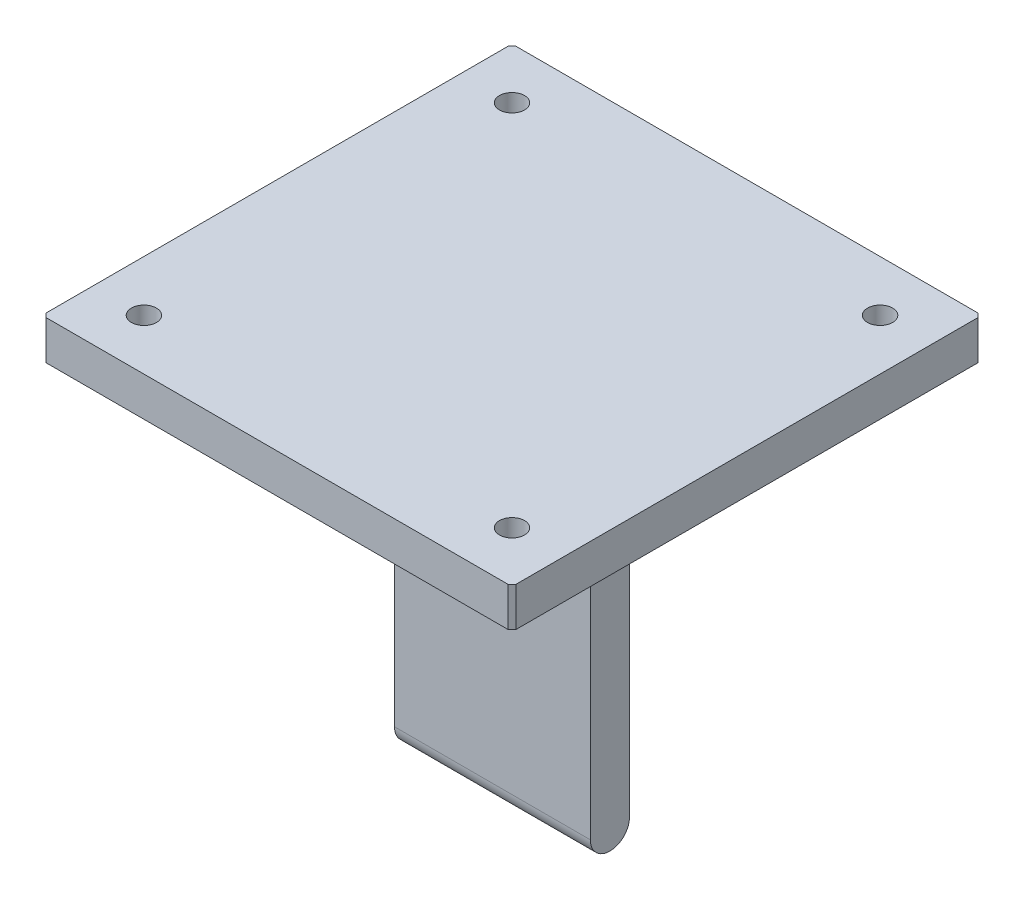
ISO-10303-21;
HEADER;
FILE_DESCRIPTION(('STEP AP214'),'2;1');
FILE_NAME('part.step','',(''),(''),'','','');
FILE_SCHEMA(('AUTOMOTIVE_DESIGN { 1 0 10303 214 1 1 1 1 }'));
ENDSEC;
DATA;
#1=APPLICATION_CONTEXT('core data for automotive mechanical design processes');
#2=APPLICATION_PROTOCOL_DEFINITION('international standard','automotive_design',2000,#1);
#3=PRODUCT_CONTEXT('',#1,'mechanical');
#4=PRODUCT('Part','Part','',(#3));
#5=PRODUCT_RELATED_PRODUCT_CATEGORY('part','',(#4));
#6=PRODUCT_DEFINITION_FORMATION('','',#4);
#7=PRODUCT_DEFINITION_CONTEXT('part definition',#1,'design');
#8=PRODUCT_DEFINITION('design','',#6,#7);
#9=PRODUCT_DEFINITION_SHAPE('','',#8);
#10=(LENGTH_UNIT() NAMED_UNIT(*) SI_UNIT(.MILLI.,.METRE.));
#11=(NAMED_UNIT(*) PLANE_ANGLE_UNIT() SI_UNIT($,.RADIAN.));
#12=(NAMED_UNIT(*) SI_UNIT($,.STERADIAN.) SOLID_ANGLE_UNIT());
#13=UNCERTAINTY_MEASURE_WITH_UNIT(LENGTH_MEASURE(1.E-05),#10,'distance_accuracy_value','');
#14=(GEOMETRIC_REPRESENTATION_CONTEXT(3) GLOBAL_UNCERTAINTY_ASSIGNED_CONTEXT((#13)) GLOBAL_UNIT_ASSIGNED_CONTEXT((#10,
#11,#12)) REPRESENTATION_CONTEXT('',''));
#15=CARTESIAN_POINT('',(0.,0.,0.));
#16=DIRECTION('',(0.,0.,1.));
#17=DIRECTION('',(1.,0.,0.));
#18=AXIS2_PLACEMENT_3D('',#15,#16,#17);
#19=CARTESIAN_POINT('',(0.,0.,0.));
#20=DIRECTION('',(0.,-1.,0.));
#21=DIRECTION('',(0.,0.,-1.));
#22=AXIS2_PLACEMENT_3D('',#19,#20,#21);
#23=PLANE('',#22);
#24=CARTESIAN_POINT('',(1.5,0.,-6.5));
#25=DIRECTION('',(0.,-1.,0.));
#26=DIRECTION('',(0.,0.,-1.));
#27=AXIS2_PLACEMENT_3D('',#24,#25,#26);
#28=CIRCLE('',#27,1.6);
#29=CARTESIAN_POINT('',(1.5,0.,-8.1));
#30=VERTEX_POINT('',#29);
#31=EDGE_CURVE('E194',#30,#30,#28,.T.);
#32=ORIENTED_EDGE('',*,*,#31,.F.);
#33=EDGE_LOOP('',(#32));
#34=FACE_BOUND('',#33,.T.);
#35=CARTESIAN_POINT('',(1.5,0.,-53.5));
#36=DIRECTION('',(0.,-1.,0.));
#37=DIRECTION('',(0.,0.,-1.));
#38=AXIS2_PLACEMENT_3D('',#35,#36,#37);
#39=CIRCLE('',#38,1.6);
#40=CARTESIAN_POINT('',(1.5,0.,-55.1));
#41=VERTEX_POINT('',#40);
#42=EDGE_CURVE('E207',#41,#41,#39,.T.);
#43=ORIENTED_EDGE('',*,*,#42,.F.);
#44=EDGE_LOOP('',(#43));
#45=FACE_BOUND('',#44,.T.);
#46=CARTESIAN_POINT('',(48.5,0.,-53.5));
#47=DIRECTION('',(0.,-1.,0.));
#48=DIRECTION('',(0.,0.,-1.));
#49=AXIS2_PLACEMENT_3D('',#46,#47,#48);
#50=CIRCLE('',#49,1.6);
#51=CARTESIAN_POINT('',(48.5,0.,-55.1));
#52=VERTEX_POINT('',#51);
#53=EDGE_CURVE('E204',#52,#52,#50,.T.);
#54=ORIENTED_EDGE('',*,*,#53,.F.);
#55=EDGE_LOOP('',(#54));
#56=FACE_BOUND('',#55,.T.);
#57=CARTESIAN_POINT('',(48.5,0.,-6.5));
#58=DIRECTION('',(0.,-1.,0.));
#59=DIRECTION('',(0.,0.,-1.));
#60=AXIS2_PLACEMENT_3D('',#57,#58,#59);
#61=CIRCLE('',#60,1.6);
#62=CARTESIAN_POINT('',(48.5,0.,-8.1));
#63=VERTEX_POINT('',#62);
#64=EDGE_CURVE('E175',#63,#63,#61,.T.);
#65=ORIENTED_EDGE('',*,*,#64,.F.);
#66=EDGE_LOOP('',(#65));
#67=FACE_BOUND('',#66,.T.);
#68=DIRECTION('',(1.,0.,0.));
#69=VECTOR('',#68,1.);
#70=CARTESIAN_POINT('',(-5.,0.,0.));
#71=LINE('',#70,#69);
#72=CARTESIAN_POINT('',(-4.49999999999997,0.,0.));
#73=VERTEX_POINT('',#72);
#74=CARTESIAN_POINT('',(54.5,0.,0.));
#75=VERTEX_POINT('',#74);
#76=EDGE_CURVE('E193',#73,#75,#71,.T.);
#77=ORIENTED_EDGE('',*,*,#76,.F.);
#78=DIRECTION('',(0.707106781186548,0.,0.707106781186548));
#79=VECTOR('',#78,1.);
#80=CARTESIAN_POINT('',(-2.24999999999999,0.,2.24999999999999));
#81=LINE('',#80,#79);
#82=CARTESIAN_POINT('',(-5.,0.,-0.500000000000019));
#83=VERTEX_POINT('',#82);
#84=EDGE_CURVE('E222',#73,#83,#81,.F.);
#85=ORIENTED_EDGE('',*,*,#84,.T.);
#86=DIRECTION('',(0.,0.,1.));
#87=VECTOR('',#86,1.);
#88=CARTESIAN_POINT('',(-5.,0.,0.));
#89=LINE('',#88,#87);
#90=CARTESIAN_POINT('',(-5.,0.,-59.5));
#91=VERTEX_POINT('',#90);
#92=EDGE_CURVE('E190',#91,#83,#89,.T.);
#93=ORIENTED_EDGE('',*,*,#92,.F.);
#94=DIRECTION('',(-0.707106781186548,0.,0.707106781186548));
#95=VECTOR('',#94,1.);
#96=CARTESIAN_POINT('',(-32.25,0.,-32.25));
#97=LINE('',#96,#95);
#98=CARTESIAN_POINT('',(-4.49999999999998,0.,-60.));
#99=VERTEX_POINT('',#98);
#100=EDGE_CURVE('E216',#91,#99,#97,.F.);
#101=ORIENTED_EDGE('',*,*,#100,.T.);
#102=DIRECTION('',(-1.,0.,0.));
#103=VECTOR('',#102,1.);
#104=CARTESIAN_POINT('',(-5.,0.,-60.));
#105=LINE('',#104,#103);
#106=CARTESIAN_POINT('',(54.5,0.,-60.));
#107=VERTEX_POINT('',#106);
#108=EDGE_CURVE('E180',#107,#99,#105,.T.);
#109=ORIENTED_EDGE('',*,*,#108,.F.);
#110=DIRECTION('',(-0.707106781186548,0.,-0.707106781186548));
#111=VECTOR('',#110,1.);
#112=CARTESIAN_POINT('',(57.25,0.,-57.25));
#113=LINE('',#112,#111);
#114=CARTESIAN_POINT('',(55.,0.,-59.5));
#115=VERTEX_POINT('',#114);
#116=EDGE_CURVE('E218',#107,#115,#113,.F.);
#117=ORIENTED_EDGE('',*,*,#116,.T.);
#118=DIRECTION('',(0.,0.,-1.));
#119=VECTOR('',#118,1.);
#120=CARTESIAN_POINT('',(55.,0.,0.));
#121=LINE('',#120,#119);
#122=CARTESIAN_POINT('',(55.,0.,-0.499999999999995));
#123=VERTEX_POINT('',#122);
#124=EDGE_CURVE('E197',#123,#115,#121,.T.);
#125=ORIENTED_EDGE('',*,*,#124,.F.);
#126=DIRECTION('',(0.707106781186552,0.,-0.707106781186543));
#127=VECTOR('',#126,1.);
#128=CARTESIAN_POINT('',(27.2499999999996,0.,27.25));
#129=LINE('',#128,#127);
#130=EDGE_CURVE('E220',#123,#75,#129,.F.);
#131=ORIENTED_EDGE('',*,*,#130,.T.);
#132=EDGE_LOOP('',(#77,#85,#93,#101,#109,#117,#125,#131));
#133=FACE_BOUND('',#132,.T.);
#134=DIRECTION('',(1.,0.,0.));
#135=VECTOR('',#134,1.);
#136=CARTESIAN_POINT('',(12.5,0.,-32.5));
#137=LINE('',#136,#135);
#138=CARTESIAN_POINT('',(12.5,0.,-32.5));
#139=VERTEX_POINT('',#138);
#140=CARTESIAN_POINT('',(37.5,0.,-32.5));
#141=VERTEX_POINT('',#140);
#142=EDGE_CURVE('E138',#139,#141,#137,.T.);
#143=ORIENTED_EDGE('',*,*,#142,.F.);
#144=DIRECTION('',(0.,0.,-1.));
#145=VECTOR('',#144,1.);
#146=CARTESIAN_POINT('',(12.5,0.,-27.5));
#147=LINE('',#146,#145);
#148=CARTESIAN_POINT('',(12.5,0.,-27.5));
#149=VERTEX_POINT('',#148);
#150=EDGE_CURVE('E146',#149,#139,#147,.T.);
#151=ORIENTED_EDGE('',*,*,#150,.F.);
#152=DIRECTION('',(-1.,0.,0.));
#153=VECTOR('',#152,1.);
#154=CARTESIAN_POINT('',(12.5,0.,-27.5));
#155=LINE('',#154,#153);
#156=CARTESIAN_POINT('',(37.5,0.,-27.5));
#157=VERTEX_POINT('',#156);
#158=EDGE_CURVE('E156',#157,#149,#155,.T.);
#159=ORIENTED_EDGE('',*,*,#158,.F.);
#160=DIRECTION('',(0.,0.,1.));
#161=VECTOR('',#160,1.);
#162=CARTESIAN_POINT('',(37.5,0.,-27.5));
#163=LINE('',#162,#161);
#164=EDGE_CURVE('E154',#141,#157,#163,.T.);
#165=ORIENTED_EDGE('',*,*,#164,.F.);
#166=EDGE_LOOP('',(#143,#151,#159,#165));
#167=FACE_BOUND('',#166,.T.);
#168=ADVANCED_FACE('F41',(#34,#45,#56,#67,#133,#167),#23,.T.);
#169=CARTESIAN_POINT('',(-5.,5.,0.));
#170=DIRECTION('',(1.,0.,0.));
#171=DIRECTION('',(0.,0.,-1.));
#172=AXIS2_PLACEMENT_3D('',#169,#170,#171);
#173=PLANE('',#172);
#174=ORIENTED_EDGE('',*,*,#92,.T.);
#175=DIRECTION('',(0.,1.,0.));
#176=VECTOR('',#175,1.);
#177=CARTESIAN_POINT('',(-5.,5.,-0.500000000000019));
#178=LINE('',#177,#176);
#179=CARTESIAN_POINT('',(-5.,5.,-0.500000000000019));
#180=VERTEX_POINT('',#179);
#181=EDGE_CURVE('E227',#83,#180,#178,.T.);
#182=ORIENTED_EDGE('',*,*,#181,.T.);
#183=DIRECTION('',(0.,0.,1.));
#184=VECTOR('',#183,1.);
#185=CARTESIAN_POINT('',(-5.,5.,0.));
#186=LINE('',#185,#184);
#187=CARTESIAN_POINT('',(-5.,5.,-59.5));
#188=VERTEX_POINT('',#187);
#189=EDGE_CURVE('E176',#188,#180,#186,.T.);
#190=ORIENTED_EDGE('',*,*,#189,.F.);
#191=DIRECTION('',(0.,-1.,0.));
#192=VECTOR('',#191,1.);
#193=CARTESIAN_POINT('',(-5.,5.,-59.5));
#194=LINE('',#193,#192);
#195=EDGE_CURVE('E224',#188,#91,#194,.T.);
#196=ORIENTED_EDGE('',*,*,#195,.T.);
#197=EDGE_LOOP('',(#174,#182,#190,#196));
#198=FACE_BOUND('',#197,.T.);
#199=ADVANCED_FACE('F274',(#198),#173,.F.);
#200=CARTESIAN_POINT('',(-5.,5.,0.));
#201=DIRECTION('',(0.,0.,-1.));
#202=DIRECTION('',(-1.,0.,0.));
#203=AXIS2_PLACEMENT_3D('',#200,#201,#202);
#204=PLANE('',#203);
#205=DIRECTION('',(1.,0.,0.));
#206=VECTOR('',#205,1.);
#207=CARTESIAN_POINT('',(-5.,5.,0.));
#208=LINE('',#207,#206);
#209=CARTESIAN_POINT('',(-4.49999999999997,5.,0.));
#210=VERTEX_POINT('',#209);
#211=CARTESIAN_POINT('',(54.5,5.,0.));
#212=VERTEX_POINT('',#211);
#213=EDGE_CURVE('E179',#210,#212,#208,.T.);
#214=ORIENTED_EDGE('',*,*,#213,.F.);
#215=DIRECTION('',(0.,-1.,0.));
#216=VECTOR('',#215,1.);
#217=CARTESIAN_POINT('',(-4.49999999999997,5.,0.));
#218=LINE('',#217,#216);
#219=EDGE_CURVE('E213',#210,#73,#218,.T.);
#220=ORIENTED_EDGE('',*,*,#219,.T.);
#221=ORIENTED_EDGE('',*,*,#76,.T.);
#222=DIRECTION('',(0.,1.,0.));
#223=VECTOR('',#222,1.);
#224=CARTESIAN_POINT('',(54.5,5.,0.));
#225=LINE('',#224,#223);
#226=EDGE_CURVE('E189',#75,#212,#225,.T.);
#227=ORIENTED_EDGE('',*,*,#226,.T.);
#228=EDGE_LOOP('',(#214,#220,#221,#227));
#229=FACE_BOUND('',#228,.T.);
#230=ADVANCED_FACE('F280',(#229),#204,.F.);
#231=CARTESIAN_POINT('',(55.,5.,0.));
#232=DIRECTION('',(-1.,0.,0.));
#233=DIRECTION('',(0.,0.,1.));
#234=AXIS2_PLACEMENT_3D('',#231,#232,#233);
#235=PLANE('',#234);
#236=DIRECTION('',(0.,0.,-1.));
#237=VECTOR('',#236,1.);
#238=CARTESIAN_POINT('',(55.,5.,0.));
#239=LINE('',#238,#237);
#240=CARTESIAN_POINT('',(55.,5.,-0.499999999999995));
#241=VERTEX_POINT('',#240);
#242=CARTESIAN_POINT('',(55.,5.,-59.5));
#243=VERTEX_POINT('',#242);
#244=EDGE_CURVE('E183',#241,#243,#239,.T.);
#245=ORIENTED_EDGE('',*,*,#244,.F.);
#246=DIRECTION('',(0.,-1.,0.));
#247=VECTOR('',#246,1.);
#248=CARTESIAN_POINT('',(55.,5.,-0.499999999999995));
#249=LINE('',#248,#247);
#250=EDGE_CURVE('E239',#241,#123,#249,.T.);
#251=ORIENTED_EDGE('',*,*,#250,.T.);
#252=ORIENTED_EDGE('',*,*,#124,.T.);
#253=DIRECTION('',(0.,1.,0.));
#254=VECTOR('',#253,1.);
#255=CARTESIAN_POINT('',(55.,5.,-59.5));
#256=LINE('',#255,#254);
#257=EDGE_CURVE('E237',#115,#243,#256,.T.);
#258=ORIENTED_EDGE('',*,*,#257,.T.);
#259=EDGE_LOOP('',(#245,#251,#252,#258));
#260=FACE_BOUND('',#259,.T.);
#261=ADVANCED_FACE('F292',(#260),#235,.F.);
#262=CARTESIAN_POINT('',(-5.,5.,-60.));
#263=DIRECTION('',(0.,0.,1.));
#264=DIRECTION('',(1.,0.,0.));
#265=AXIS2_PLACEMENT_3D('',#262,#263,#264);
#266=PLANE('',#265);
#267=DIRECTION('',(-1.,0.,0.));
#268=VECTOR('',#267,1.);
#269=CARTESIAN_POINT('',(-5.,5.,-60.));
#270=LINE('',#269,#268);
#271=CARTESIAN_POINT('',(54.5,5.,-60.));
#272=VERTEX_POINT('',#271);
#273=CARTESIAN_POINT('',(-4.49999999999998,5.,-60.));
#274=VERTEX_POINT('',#273);
#275=EDGE_CURVE('E186',#272,#274,#270,.T.);
#276=ORIENTED_EDGE('',*,*,#275,.F.);
#277=DIRECTION('',(0.,-1.,0.));
#278=VECTOR('',#277,1.);
#279=CARTESIAN_POINT('',(54.5,5.,-60.));
#280=LINE('',#279,#278);
#281=EDGE_CURVE('E244',#272,#107,#280,.T.);
#282=ORIENTED_EDGE('',*,*,#281,.T.);
#283=ORIENTED_EDGE('',*,*,#108,.T.);
#284=DIRECTION('',(0.,1.,0.));
#285=VECTOR('',#284,1.);
#286=CARTESIAN_POINT('',(-4.49999999999998,5.,-60.));
#287=LINE('',#286,#285);
#288=EDGE_CURVE('E242',#99,#274,#287,.T.);
#289=ORIENTED_EDGE('',*,*,#288,.T.);
#290=EDGE_LOOP('',(#276,#282,#283,#289));
#291=FACE_BOUND('',#290,.T.);
#292=ADVANCED_FACE('F289',(#291),#266,.F.);
#293=CARTESIAN_POINT('',(0.,5.,0.));
#294=DIRECTION('',(0.,-1.,0.));
#295=DIRECTION('',(0.,0.,-1.));
#296=AXIS2_PLACEMENT_3D('',#293,#294,#295);
#297=PLANE('',#296);
#298=CARTESIAN_POINT('',(1.5,5.,-6.5));
#299=DIRECTION('',(0.,1.,0.));
#300=DIRECTION('',(0.,0.,1.));
#301=AXIS2_PLACEMENT_3D('',#298,#299,#300);
#302=CIRCLE('',#301,1.6);
#303=CARTESIAN_POINT('',(1.5,5.,-4.9));
#304=VERTEX_POINT('',#303);
#305=EDGE_CURVE('E142',#304,#304,#302,.T.);
#306=ORIENTED_EDGE('',*,*,#305,.F.);
#307=EDGE_LOOP('',(#306));
#308=FACE_BOUND('',#307,.T.);
#309=CARTESIAN_POINT('',(1.5,5.,-53.5));
#310=DIRECTION('',(0.,1.,0.));
#311=DIRECTION('',(0.,0.,1.));
#312=AXIS2_PLACEMENT_3D('',#309,#310,#311);
#313=CIRCLE('',#312,1.6);
#314=CARTESIAN_POINT('',(1.5,5.,-51.9));
#315=VERTEX_POINT('',#314);
#316=EDGE_CURVE('E168',#315,#315,#313,.T.);
#317=ORIENTED_EDGE('',*,*,#316,.F.);
#318=EDGE_LOOP('',(#317));
#319=FACE_BOUND('',#318,.T.);
#320=CARTESIAN_POINT('',(48.5,5.,-53.5));
#321=DIRECTION('',(0.,1.,0.));
#322=DIRECTION('',(0.,0.,1.));
#323=AXIS2_PLACEMENT_3D('',#320,#321,#322);
#324=CIRCLE('',#323,1.6);
#325=CARTESIAN_POINT('',(48.5,5.,-51.9));
#326=VERTEX_POINT('',#325);
#327=EDGE_CURVE('E164',#326,#326,#324,.T.);
#328=ORIENTED_EDGE('',*,*,#327,.F.);
#329=EDGE_LOOP('',(#328));
#330=FACE_BOUND('',#329,.T.);
#331=CARTESIAN_POINT('',(48.5,5.,-6.5));
#332=DIRECTION('',(0.,1.,0.));
#333=DIRECTION('',(0.,0.,1.));
#334=AXIS2_PLACEMENT_3D('',#331,#332,#333);
#335=CIRCLE('',#334,1.6);
#336=CARTESIAN_POINT('',(48.5,5.,-4.9));
#337=VERTEX_POINT('',#336);
#338=EDGE_CURVE('E167',#337,#337,#335,.T.);
#339=ORIENTED_EDGE('',*,*,#338,.F.);
#340=EDGE_LOOP('',(#339));
#341=FACE_BOUND('',#340,.T.);
#342=ORIENTED_EDGE('',*,*,#189,.T.);
#343=DIRECTION('',(-0.707106781186548,0.,-0.707106781186548));
#344=VECTOR('',#343,1.);
#345=CARTESIAN_POINT('',(-4.49999999999997,5.,0.));
#346=LINE('',#345,#344);
#347=EDGE_CURVE('E235',#180,#210,#346,.F.);
#348=ORIENTED_EDGE('',*,*,#347,.T.);
#349=ORIENTED_EDGE('',*,*,#213,.T.);
#350=DIRECTION('',(-0.707106781186552,0.,0.707106781186543));
#351=VECTOR('',#350,1.);
#352=CARTESIAN_POINT('',(55.,5.,-0.499999999999995));
#353=LINE('',#352,#351);
#354=EDGE_CURVE('E233',#212,#241,#353,.F.);
#355=ORIENTED_EDGE('',*,*,#354,.T.);
#356=ORIENTED_EDGE('',*,*,#244,.T.);
#357=DIRECTION('',(0.707106781186548,0.,0.707106781186548));
#358=VECTOR('',#357,1.);
#359=CARTESIAN_POINT('',(54.5,5.,-60.));
#360=LINE('',#359,#358);
#361=EDGE_CURVE('E231',#243,#272,#360,.F.);
#362=ORIENTED_EDGE('',*,*,#361,.T.);
#363=ORIENTED_EDGE('',*,*,#275,.T.);
#364=DIRECTION('',(0.707106781186548,0.,-0.707106781186548));
#365=VECTOR('',#364,1.);
#366=CARTESIAN_POINT('',(-5.,5.,-59.5));
#367=LINE('',#366,#365);
#368=EDGE_CURVE('E229',#274,#188,#367,.F.);
#369=ORIENTED_EDGE('',*,*,#368,.T.);
#370=EDGE_LOOP('',(#342,#348,#349,#355,#356,#362,#363,#369));
#371=FACE_BOUND('',#370,.T.);
#372=ADVANCED_FACE('F287',(#308,#319,#330,#341,#371),#297,.F.);
#373=CARTESIAN_POINT('',(48.5,-5.,-6.5));
#374=DIRECTION('',(0.,1.,0.));
#375=DIRECTION('',(0.,0.,1.));
#376=AXIS2_PLACEMENT_3D('',#373,#374,#375);
#377=CYLINDRICAL_SURFACE('',#376,1.6);
#378=ORIENTED_EDGE('',*,*,#64,.T.);
#379=EDGE_LOOP('',(#378));
#380=FACE_BOUND('',#379,.T.);
#381=ORIENTED_EDGE('',*,*,#338,.T.);
#382=EDGE_LOOP('',(#381));
#383=FACE_BOUND('',#382,.T.);
#384=ADVANCED_FACE('F400',(#380,#383),#377,.F.);
#385=CARTESIAN_POINT('',(48.5,-5.,-53.5));
#386=DIRECTION('',(0.,1.,0.));
#387=DIRECTION('',(0.,0.,1.));
#388=AXIS2_PLACEMENT_3D('',#385,#386,#387);
#389=CYLINDRICAL_SURFACE('',#388,1.6);
#390=ORIENTED_EDGE('',*,*,#53,.T.);
#391=EDGE_LOOP('',(#390));
#392=FACE_BOUND('',#391,.T.);
#393=ORIENTED_EDGE('',*,*,#327,.T.);
#394=EDGE_LOOP('',(#393));
#395=FACE_BOUND('',#394,.T.);
#396=ADVANCED_FACE('F443',(#392,#395),#389,.F.);
#397=CARTESIAN_POINT('',(1.5,-5.,-53.5));
#398=DIRECTION('',(0.,1.,0.));
#399=DIRECTION('',(0.,0.,1.));
#400=AXIS2_PLACEMENT_3D('',#397,#398,#399);
#401=CYLINDRICAL_SURFACE('',#400,1.6);
#402=ORIENTED_EDGE('',*,*,#42,.T.);
#403=EDGE_LOOP('',(#402));
#404=FACE_BOUND('',#403,.T.);
#405=ORIENTED_EDGE('',*,*,#316,.T.);
#406=EDGE_LOOP('',(#405));
#407=FACE_BOUND('',#406,.T.);
#408=ADVANCED_FACE('F433',(#404,#407),#401,.F.);
#409=CARTESIAN_POINT('',(1.5,-5.,-6.5));
#410=DIRECTION('',(0.,1.,0.));
#411=DIRECTION('',(0.,0.,1.));
#412=AXIS2_PLACEMENT_3D('',#409,#410,#411);
#413=CYLINDRICAL_SURFACE('',#412,1.6);
#414=ORIENTED_EDGE('',*,*,#31,.T.);
#415=EDGE_LOOP('',(#414));
#416=FACE_BOUND('',#415,.T.);
#417=ORIENTED_EDGE('',*,*,#305,.T.);
#418=EDGE_LOOP('',(#417));
#419=FACE_BOUND('',#418,.T.);
#420=ADVANCED_FACE('F308',(#416,#419),#413,.F.);
#421=CARTESIAN_POINT('',(-4.49999999999997,5.,0.));
#422=DIRECTION('',(0.707106781186547,0.,-0.707106781186547));
#423=DIRECTION('',(0.,-1.,0.));
#424=AXIS2_PLACEMENT_3D('',#421,#422,#423);
#425=PLANE('',#424);
#426=ORIENTED_EDGE('',*,*,#347,.F.);
#427=ORIENTED_EDGE('',*,*,#181,.F.);
#428=ORIENTED_EDGE('',*,*,#84,.F.);
#429=ORIENTED_EDGE('',*,*,#219,.F.);
#430=EDGE_LOOP('',(#426,#427,#428,#429));
#431=FACE_BOUND('',#430,.T.);
#432=ADVANCED_FACE('F301',(#431),#425,.F.);
#433=CARTESIAN_POINT('',(55.,5.,-0.499999999999995));
#434=DIRECTION('',(-0.707106781186543,0.,-0.707106781186552));
#435=DIRECTION('',(0.,-1.,0.));
#436=AXIS2_PLACEMENT_3D('',#433,#434,#435);
#437=PLANE('',#436);
#438=ORIENTED_EDGE('',*,*,#354,.F.);
#439=ORIENTED_EDGE('',*,*,#226,.F.);
#440=ORIENTED_EDGE('',*,*,#130,.F.);
#441=ORIENTED_EDGE('',*,*,#250,.F.);
#442=EDGE_LOOP('',(#438,#439,#440,#441));
#443=FACE_BOUND('',#442,.T.);
#444=ADVANCED_FACE('F307',(#443),#437,.F.);
#445=CARTESIAN_POINT('',(54.5,5.,-60.));
#446=DIRECTION('',(-0.707106781186547,0.,0.707106781186547));
#447=DIRECTION('',(0.,-1.,0.));
#448=AXIS2_PLACEMENT_3D('',#445,#446,#447);
#449=PLANE('',#448);
#450=ORIENTED_EDGE('',*,*,#361,.F.);
#451=ORIENTED_EDGE('',*,*,#257,.F.);
#452=ORIENTED_EDGE('',*,*,#116,.F.);
#453=ORIENTED_EDGE('',*,*,#281,.F.);
#454=EDGE_LOOP('',(#450,#451,#452,#453));
#455=FACE_BOUND('',#454,.T.);
#456=ADVANCED_FACE('F315',(#455),#449,.F.);
#457=CARTESIAN_POINT('',(-5.,5.,-59.5));
#458=DIRECTION('',(0.707106781186547,0.,0.707106781186547));
#459=DIRECTION('',(0.,-1.,0.));
#460=AXIS2_PLACEMENT_3D('',#457,#458,#459);
#461=PLANE('',#460);
#462=ORIENTED_EDGE('',*,*,#368,.F.);
#463=ORIENTED_EDGE('',*,*,#288,.F.);
#464=ORIENTED_EDGE('',*,*,#100,.F.);
#465=ORIENTED_EDGE('',*,*,#195,.F.);
#466=EDGE_LOOP('',(#462,#463,#464,#465));
#467=FACE_BOUND('',#466,.T.);
#468=ADVANCED_FACE('F322',(#467),#461,.F.);
#469=CARTESIAN_POINT('',(12.5,-48.,-27.5));
#470=DIRECTION('',(1.,0.,0.));
#471=DIRECTION('',(0.,0.,-1.));
#472=AXIS2_PLACEMENT_3D('',#469,#470,#471);
#473=PLANE('',#472);
#474=DIRECTION('',(0.,1.,0.));
#475=VECTOR('',#474,1.);
#476=CARTESIAN_POINT('',(12.5,-48.,-32.5));
#477=LINE('',#476,#475);
#478=CARTESIAN_POINT('',(12.5,-45.5,-32.5));
#479=VERTEX_POINT('',#478);
#480=EDGE_CURVE('E133',#479,#139,#477,.T.);
#481=ORIENTED_EDGE('',*,*,#480,.F.);
#482=CARTESIAN_POINT('',(12.5,-45.5,-30.));
#483=DIRECTION('',(1.,0.,0.));
#484=DIRECTION('',(0.,0.,-1.));
#485=AXIS2_PLACEMENT_3D('',#482,#483,#484);
#486=CIRCLE('',#485,2.5);
#487=CARTESIAN_POINT('',(12.5,-48.,-30.));
#488=VERTEX_POINT('',#487);
#489=EDGE_CURVE('E50',#479,#488,#486,.F.);
#490=ORIENTED_EDGE('',*,*,#489,.T.);
#491=CARTESIAN_POINT('',(12.5,-45.5,-30.));
#492=DIRECTION('',(1.,0.,0.));
#493=DIRECTION('',(0.,0.,-1.));
#494=AXIS2_PLACEMENT_3D('',#491,#492,#493);
#495=CIRCLE('',#494,2.5);
#496=CARTESIAN_POINT('',(12.5,-45.5,-27.5));
#497=VERTEX_POINT('',#496);
#498=EDGE_CURVE('E57',#488,#497,#495,.F.);
#499=ORIENTED_EDGE('',*,*,#498,.T.);
#500=DIRECTION('',(0.,1.,0.));
#501=VECTOR('',#500,1.);
#502=CARTESIAN_POINT('',(12.5,-48.,-27.5));
#503=LINE('',#502,#501);
#504=EDGE_CURVE('E148',#497,#149,#503,.T.);
#505=ORIENTED_EDGE('',*,*,#504,.T.);
#506=ORIENTED_EDGE('',*,*,#150,.T.);
#507=EDGE_LOOP('',(#481,#490,#499,#505,#506));
#508=FACE_BOUND('',#507,.T.);
#509=ADVANCED_FACE('F147',(#508),#473,.F.);
#510=CARTESIAN_POINT('',(12.5,-48.,-32.5));
#511=DIRECTION('',(0.,0.,1.));
#512=DIRECTION('',(1.,0.,0.));
#513=AXIS2_PLACEMENT_3D('',#510,#511,#512);
#514=PLANE('',#513);
#515=DIRECTION('',(0.,1.,0.));
#516=VECTOR('',#515,1.);
#517=CARTESIAN_POINT('',(37.5,-48.,-32.5));
#518=LINE('',#517,#516);
#519=CARTESIAN_POINT('',(37.5,-45.5,-32.5));
#520=VERTEX_POINT('',#519);
#521=EDGE_CURVE('E143',#520,#141,#518,.T.);
#522=ORIENTED_EDGE('',*,*,#521,.F.);
#523=DIRECTION('',(1.,0.,0.));
#524=VECTOR('',#523,1.);
#525=CARTESIAN_POINT('',(12.5,-45.5,-32.5));
#526=LINE('',#525,#524);
#527=EDGE_CURVE('E141',#520,#479,#526,.F.);
#528=ORIENTED_EDGE('',*,*,#527,.T.);
#529=ORIENTED_EDGE('',*,*,#480,.T.);
#530=ORIENTED_EDGE('',*,*,#142,.T.);
#531=EDGE_LOOP('',(#522,#528,#529,#530));
#532=FACE_BOUND('',#531,.T.);
#533=ADVANCED_FACE('F136',(#532),#514,.F.);
#534=CARTESIAN_POINT('',(37.5,-48.,-27.5));
#535=DIRECTION('',(-1.,0.,0.));
#536=DIRECTION('',(0.,0.,1.));
#537=AXIS2_PLACEMENT_3D('',#534,#535,#536);
#538=PLANE('',#537);
#539=CARTESIAN_POINT('',(37.5,-45.5,-30.));
#540=DIRECTION('',(-1.,0.,0.));
#541=DIRECTION('',(0.,0.,1.));
#542=AXIS2_PLACEMENT_3D('',#539,#540,#541);
#543=CIRCLE('',#542,2.5);
#544=CARTESIAN_POINT('',(37.5,-45.5,-27.5));
#545=VERTEX_POINT('',#544);
#546=CARTESIAN_POINT('',(37.5,-48.,-30.));
#547=VERTEX_POINT('',#546);
#548=EDGE_CURVE('E247',#545,#547,#543,.F.);
#549=ORIENTED_EDGE('',*,*,#548,.T.);
#550=CARTESIAN_POINT('',(37.5,-45.5,-30.));
#551=DIRECTION('',(-1.,0.,0.));
#552=DIRECTION('',(0.,0.,1.));
#553=AXIS2_PLACEMENT_3D('',#550,#551,#552);
#554=CIRCLE('',#553,2.5);
#555=EDGE_CURVE('E249',#547,#520,#554,.F.);
#556=ORIENTED_EDGE('',*,*,#555,.T.);
#557=ORIENTED_EDGE('',*,*,#521,.T.);
#558=ORIENTED_EDGE('',*,*,#164,.T.);
#559=DIRECTION('',(0.,1.,0.));
#560=VECTOR('',#559,1.);
#561=CARTESIAN_POINT('',(37.5,-48.,-27.5));
#562=LINE('',#561,#560);
#563=EDGE_CURVE('E161',#545,#157,#562,.T.);
#564=ORIENTED_EDGE('',*,*,#563,.F.);
#565=EDGE_LOOP('',(#549,#556,#557,#558,#564));
#566=FACE_BOUND('',#565,.T.);
#567=ADVANCED_FACE('F255',(#566),#538,.F.);
#568=CARTESIAN_POINT('',(12.5,-48.,-27.5));
#569=DIRECTION('',(0.,0.,-1.));
#570=DIRECTION('',(-1.,0.,0.));
#571=AXIS2_PLACEMENT_3D('',#568,#569,#570);
#572=PLANE('',#571);
#573=ORIENTED_EDGE('',*,*,#504,.F.);
#574=DIRECTION('',(-1.,0.,0.));
#575=VECTOR('',#574,1.);
#576=CARTESIAN_POINT('',(37.5,-45.5,-27.5));
#577=LINE('',#576,#575);
#578=EDGE_CURVE('E11',#497,#545,#577,.F.);
#579=ORIENTED_EDGE('',*,*,#578,.T.);
#580=ORIENTED_EDGE('',*,*,#563,.T.);
#581=ORIENTED_EDGE('',*,*,#158,.T.);
#582=EDGE_LOOP('',(#573,#579,#580,#581));
#583=FACE_BOUND('',#582,.T.);
#584=ADVANCED_FACE('F265',(#583),#572,.F.);
#585=CARTESIAN_POINT('',(0.,-45.5,-30.));
#586=DIRECTION('',(1.,0.,0.));
#587=DIRECTION('',(0.,0.,-1.));
#588=AXIS2_PLACEMENT_3D('',#585,#586,#587);
#589=CYLINDRICAL_SURFACE('',#588,2.5);
#590=ORIENTED_EDGE('',*,*,#578,.F.);
#591=ORIENTED_EDGE('',*,*,#498,.F.);
#592=DIRECTION('',(-1.,0.,0.));
#593=VECTOR('',#592,1.);
#594=CARTESIAN_POINT('',(12.5,-48.,-30.));
#595=LINE('',#594,#593);
#596=EDGE_CURVE('E45',#547,#488,#595,.T.);
#597=ORIENTED_EDGE('',*,*,#596,.F.);
#598=ORIENTED_EDGE('',*,*,#548,.F.);
#599=EDGE_LOOP('',(#590,#591,#597,#598));
#600=FACE_BOUND('',#599,.T.);
#601=ADVANCED_FACE('F43',(#600),#589,.T.);
#602=CARTESIAN_POINT('',(0.,-45.5,-30.));
#603=DIRECTION('',(-1.,0.,0.));
#604=DIRECTION('',(0.,0.,1.));
#605=AXIS2_PLACEMENT_3D('',#602,#603,#604);
#606=CYLINDRICAL_SURFACE('',#605,2.5);
#607=ORIENTED_EDGE('',*,*,#489,.F.);
#608=ORIENTED_EDGE('',*,*,#527,.F.);
#609=ORIENTED_EDGE('',*,*,#555,.F.);
#610=ORIENTED_EDGE('',*,*,#596,.T.);
#611=EDGE_LOOP('',(#607,#608,#609,#610));
#612=FACE_BOUND('',#611,.T.);
#613=ADVANCED_FACE('F261',(#612),#606,.T.);
#614=CLOSED_SHELL('',(#168,#199,#230,#261,#292,#372,#384,#396,#408,#420,#432,#444,#456,#468,
#509,#533,#567,#584,#601,#613));
#615=MANIFOLD_SOLID_BREP('B2',#614);
#616=ADVANCED_BREP_SHAPE_REPRESENTATION('',(#18,#615),#14);
#617=SHAPE_DEFINITION_REPRESENTATION(#9,#616);
ENDSEC;
END-ISO-10303-21;
